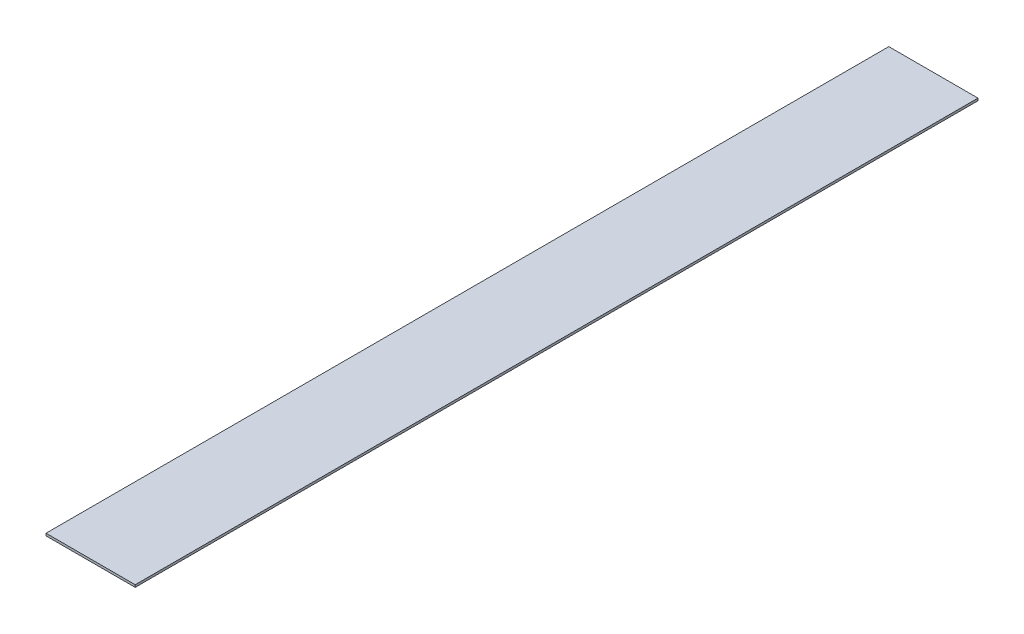
ISO-10303-21;
HEADER;
FILE_DESCRIPTION(('STEP AP214'),'2;1');
FILE_NAME('part.step','',(''),(''),'','','');
FILE_SCHEMA(('AUTOMOTIVE_DESIGN { 1 0 10303 214 1 1 1 1 }'));
ENDSEC;
DATA;
#1=APPLICATION_CONTEXT('core data for automotive mechanical design processes');
#2=APPLICATION_PROTOCOL_DEFINITION('international standard','automotive_design',2000,#1);
#3=PRODUCT_CONTEXT('',#1,'mechanical');
#4=PRODUCT('Part','Part','',(#3));
#5=PRODUCT_RELATED_PRODUCT_CATEGORY('part','',(#4));
#6=PRODUCT_DEFINITION_FORMATION('','',#4);
#7=PRODUCT_DEFINITION_CONTEXT('part definition',#1,'design');
#8=PRODUCT_DEFINITION('design','',#6,#7);
#9=PRODUCT_DEFINITION_SHAPE('','',#8);
#10=(LENGTH_UNIT() NAMED_UNIT(*) SI_UNIT(.MILLI.,.METRE.));
#11=(NAMED_UNIT(*) PLANE_ANGLE_UNIT() SI_UNIT($,.RADIAN.));
#12=(NAMED_UNIT(*) SI_UNIT($,.STERADIAN.) SOLID_ANGLE_UNIT());
#13=UNCERTAINTY_MEASURE_WITH_UNIT(LENGTH_MEASURE(1.E-05),#10,'distance_accuracy_value','');
#14=(GEOMETRIC_REPRESENTATION_CONTEXT(3) GLOBAL_UNCERTAINTY_ASSIGNED_CONTEXT((#13)) GLOBAL_UNIT_ASSIGNED_CONTEXT((#10,
#11,#12)) REPRESENTATION_CONTEXT('',''));
#15=CARTESIAN_POINT('',(0.,0.,0.));
#16=DIRECTION('',(0.,0.,1.));
#17=DIRECTION('',(1.,0.,0.));
#18=AXIS2_PLACEMENT_3D('',#15,#16,#17);
#19=CARTESIAN_POINT('',(-11.6504852632874,12.4777664737229,0.));
#20=DIRECTION('',(0.,1.,0.));
#21=DIRECTION('',(0.,0.,1.));
#22=AXIS2_PLACEMENT_3D('',#19,#20,#21);
#23=PLANE('',#22);
#24=DIRECTION('',(1.,0.,0.));
#25=VECTOR('',#24,1.);
#26=CARTESIAN_POINT('',(-8.47548526328744,12.4777664737229,0.));
#27=LINE('',#26,#25);
#28=CARTESIAN_POINT('',(-5.30048526328744,12.4777664737229,0.));
#29=VERTEX_POINT('',#28);
#30=CARTESIAN_POINT('',(-11.6504852632874,12.4777664737229,0.));
#31=VERTEX_POINT('',#30);
#32=EDGE_CURVE('E53',#29,#31,#27,.F.);
#33=ORIENTED_EDGE('',*,*,#32,.T.);
#34=DIRECTION('',(0.,0.,1.));
#35=VECTOR('',#34,1.);
#36=CARTESIAN_POINT('',(-11.6504852632874,12.4777664737229,0.));
#37=LINE('',#36,#35);
#38=CARTESIAN_POINT('',(-11.6504852632874,12.4777664737229,60.));
#39=VERTEX_POINT('',#38);
#40=EDGE_CURVE('E72',#39,#31,#37,.F.);
#41=ORIENTED_EDGE('',*,*,#40,.F.);
#42=DIRECTION('',(1.,0.,0.));
#43=VECTOR('',#42,1.);
#44=CARTESIAN_POINT('',(-8.47548526328744,12.4777664737229,60.));
#45=LINE('',#44,#43);
#46=CARTESIAN_POINT('',(-5.30048526328744,12.4777664737229,60.));
#47=VERTEX_POINT('',#46);
#48=EDGE_CURVE('E62',#47,#39,#45,.F.);
#49=ORIENTED_EDGE('',*,*,#48,.F.);
#50=DIRECTION('',(0.,0.,-1.));
#51=VECTOR('',#50,1.);
#52=CARTESIAN_POINT('',(-5.30048526328744,12.4777664737229,0.));
#53=LINE('',#52,#51);
#54=EDGE_CURVE('E83',#29,#47,#53,.F.);
#55=ORIENTED_EDGE('',*,*,#54,.F.);
#56=EDGE_LOOP('',(#33,#41,#49,#55));
#57=FACE_BOUND('',#56,.T.);
#58=ADVANCED_FACE('F17',(#57),#23,.T.);
#59=CARTESIAN_POINT('',(-8.47548526328744,12.3952164737229,60.));
#60=DIRECTION('',(0.,0.,1.));
#61=DIRECTION('',(1.,0.,0.));
#62=AXIS2_PLACEMENT_3D('',#59,#60,#61);
#63=PLANE('',#62);
#64=DIRECTION('',(0.,1.,0.));
#65=VECTOR('',#64,1.);
#66=CARTESIAN_POINT('',(-11.6504852632874,12.3126664737229,60.));
#67=LINE('',#66,#65);
#68=CARTESIAN_POINT('',(-11.6504852632874,12.3126664737229,60.));
#69=VERTEX_POINT('',#68);
#70=EDGE_CURVE('E66',#69,#39,#67,.T.);
#71=ORIENTED_EDGE('',*,*,#70,.F.);
#72=DIRECTION('',(1.,0.,0.));
#73=VECTOR('',#72,1.);
#74=CARTESIAN_POINT('',(-5.30048526328744,12.3126664737229,60.));
#75=LINE('',#74,#73);
#76=CARTESIAN_POINT('',(-5.30048526328744,12.3126664737229,60.));
#77=VERTEX_POINT('',#76);
#78=EDGE_CURVE('E21',#77,#69,#75,.F.);
#79=ORIENTED_EDGE('',*,*,#78,.F.);
#80=DIRECTION('',(0.,1.,0.));
#81=VECTOR('',#80,1.);
#82=CARTESIAN_POINT('',(-5.30048526328744,12.4777664737229,60.));
#83=LINE('',#82,#81);
#84=EDGE_CURVE('E68',#47,#77,#83,.F.);
#85=ORIENTED_EDGE('',*,*,#84,.F.);
#86=ORIENTED_EDGE('',*,*,#48,.T.);
#87=EDGE_LOOP('',(#71,#79,#85,#86));
#88=FACE_BOUND('',#87,.T.);
#89=ADVANCED_FACE('F64',(#88),#63,.T.);
#90=CARTESIAN_POINT('',(-11.6504852632874,12.3126664737229,0.));
#91=DIRECTION('',(-1.,0.,0.));
#92=DIRECTION('',(0.,0.,1.));
#93=AXIS2_PLACEMENT_3D('',#90,#91,#92);
#94=PLANE('',#93);
#95=DIRECTION('',(0.,1.,0.));
#96=VECTOR('',#95,1.);
#97=CARTESIAN_POINT('',(-11.6504852632874,12.3952164737229,0.));
#98=LINE('',#97,#96);
#99=CARTESIAN_POINT('',(-11.6504852632874,12.3126664737229,0.));
#100=VERTEX_POINT('',#99);
#101=EDGE_CURVE('E74',#31,#100,#98,.F.);
#102=ORIENTED_EDGE('',*,*,#101,.T.);
#103=DIRECTION('',(0.,0.,-1.));
#104=VECTOR('',#103,1.);
#105=CARTESIAN_POINT('',(-11.6504852632874,12.3126664737229,0.));
#106=LINE('',#105,#104);
#107=EDGE_CURVE('E78',#69,#100,#106,.T.);
#108=ORIENTED_EDGE('',*,*,#107,.F.);
#109=ORIENTED_EDGE('',*,*,#70,.T.);
#110=ORIENTED_EDGE('',*,*,#40,.T.);
#111=EDGE_LOOP('',(#102,#108,#109,#110));
#112=FACE_BOUND('',#111,.T.);
#113=ADVANCED_FACE('F76',(#112),#94,.T.);
#114=CARTESIAN_POINT('',(-8.47548526328744,12.3952164737229,0.));
#115=DIRECTION('',(0.,0.,1.));
#116=DIRECTION('',(1.,0.,0.));
#117=AXIS2_PLACEMENT_3D('',#114,#115,#116);
#118=PLANE('',#117);
#119=DIRECTION('',(0.,1.,0.));
#120=VECTOR('',#119,1.);
#121=CARTESIAN_POINT('',(-5.30048526328744,12.4777664737229,0.));
#122=LINE('',#121,#120);
#123=CARTESIAN_POINT('',(-5.30048526328744,12.3126664737229,0.));
#124=VERTEX_POINT('',#123);
#125=EDGE_CURVE('E36',#124,#29,#122,.T.);
#126=ORIENTED_EDGE('',*,*,#125,.F.);
#127=DIRECTION('',(1.,0.,0.));
#128=VECTOR('',#127,1.);
#129=CARTESIAN_POINT('',(-5.30048526328744,12.3126664737229,0.));
#130=LINE('',#129,#128);
#131=EDGE_CURVE('E27',#100,#124,#130,.T.);
#132=ORIENTED_EDGE('',*,*,#131,.F.);
#133=ORIENTED_EDGE('',*,*,#101,.F.);
#134=ORIENTED_EDGE('',*,*,#32,.F.);
#135=EDGE_LOOP('',(#126,#132,#133,#134));
#136=FACE_BOUND('',#135,.T.);
#137=ADVANCED_FACE('F92',(#136),#118,.F.);
#138=CARTESIAN_POINT('',(-5.30048526328744,12.4777664737229,0.));
#139=DIRECTION('',(1.,0.,0.));
#140=DIRECTION('',(0.,0.,-1.));
#141=AXIS2_PLACEMENT_3D('',#138,#139,#140);
#142=PLANE('',#141);
#143=ORIENTED_EDGE('',*,*,#125,.T.);
#144=ORIENTED_EDGE('',*,*,#54,.T.);
#145=ORIENTED_EDGE('',*,*,#84,.T.);
#146=DIRECTION('',(0.,0.,-1.));
#147=VECTOR('',#146,1.);
#148=CARTESIAN_POINT('',(-5.30048526328744,12.3126664737229,0.));
#149=LINE('',#148,#147);
#150=EDGE_CURVE('E11',#124,#77,#149,.F.);
#151=ORIENTED_EDGE('',*,*,#150,.F.);
#152=EDGE_LOOP('',(#143,#144,#145,#151));
#153=FACE_BOUND('',#152,.T.);
#154=ADVANCED_FACE('F90',(#153),#142,.T.);
#155=CARTESIAN_POINT('',(-5.30048526328744,12.3126664737229,0.));
#156=DIRECTION('',(0.,-1.,0.));
#157=DIRECTION('',(0.,0.,-1.));
#158=AXIS2_PLACEMENT_3D('',#155,#156,#157);
#159=PLANE('',#158);
#160=ORIENTED_EDGE('',*,*,#131,.T.);
#161=ORIENTED_EDGE('',*,*,#150,.T.);
#162=ORIENTED_EDGE('',*,*,#78,.T.);
#163=ORIENTED_EDGE('',*,*,#107,.T.);
#164=EDGE_LOOP('',(#160,#161,#162,#163));
#165=FACE_BOUND('',#164,.T.);
#166=ADVANCED_FACE('F19',(#165),#159,.T.);
#167=CLOSED_SHELL('',(#58,#89,#113,#137,#154,#166));
#168=MANIFOLD_SOLID_BREP('B1',#167);
#169=ADVANCED_BREP_SHAPE_REPRESENTATION('',(#18,#168),#14);
#170=SHAPE_DEFINITION_REPRESENTATION(#9,#169);
ENDSEC;
END-ISO-10303-21;
